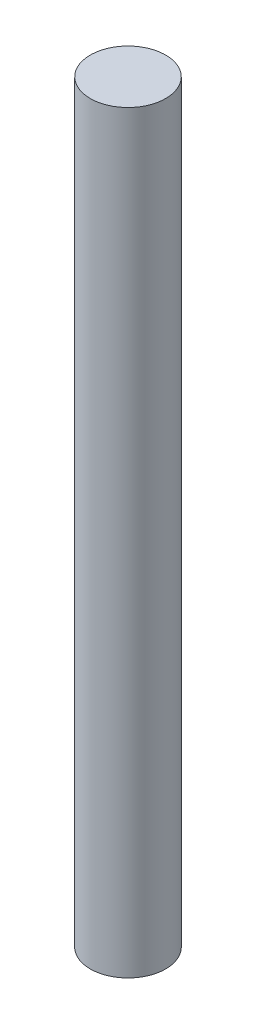
ISO-10303-21;
HEADER;
FILE_DESCRIPTION(('STEP AP214'),'2;1');
FILE_NAME('part.step','',(''),(''),'','','');
FILE_SCHEMA(('AUTOMOTIVE_DESIGN { 1 0 10303 214 1 1 1 1 }'));
ENDSEC;
DATA;
#1=APPLICATION_CONTEXT('core data for automotive mechanical design processes');
#2=APPLICATION_PROTOCOL_DEFINITION('international standard','automotive_design',2000,#1);
#3=PRODUCT_CONTEXT('',#1,'mechanical');
#4=PRODUCT('Part','Part','',(#3));
#5=PRODUCT_RELATED_PRODUCT_CATEGORY('part','',(#4));
#6=PRODUCT_DEFINITION_FORMATION('','',#4);
#7=PRODUCT_DEFINITION_CONTEXT('part definition',#1,'design');
#8=PRODUCT_DEFINITION('design','',#6,#7);
#9=PRODUCT_DEFINITION_SHAPE('','',#8);
#10=(LENGTH_UNIT() NAMED_UNIT(*) SI_UNIT(.MILLI.,.METRE.));
#11=(NAMED_UNIT(*) PLANE_ANGLE_UNIT() SI_UNIT($,.RADIAN.));
#12=(NAMED_UNIT(*) SI_UNIT($,.STERADIAN.) SOLID_ANGLE_UNIT());
#13=UNCERTAINTY_MEASURE_WITH_UNIT(LENGTH_MEASURE(1.E-05),#10,'distance_accuracy_value','');
#14=(GEOMETRIC_REPRESENTATION_CONTEXT(3) GLOBAL_UNCERTAINTY_ASSIGNED_CONTEXT((#13)) GLOBAL_UNIT_ASSIGNED_CONTEXT((#10,
#11,#12)) REPRESENTATION_CONTEXT('',''));
#15=CARTESIAN_POINT('',(0.,0.,0.));
#16=DIRECTION('',(0.,0.,1.));
#17=DIRECTION('',(1.,0.,0.));
#18=AXIS2_PLACEMENT_3D('',#15,#16,#17);
#19=CARTESIAN_POINT('',(0.,254.,0.));
#20=DIRECTION('',(0.,-1.,0.));
#21=DIRECTION('',(0.,0.,-1.));
#22=AXIS2_PLACEMENT_3D('',#19,#20,#21);
#23=CYLINDRICAL_SURFACE('',#22,12.7);
#24=CARTESIAN_POINT('',(0.,254.,0.));
#25=DIRECTION('',(0.,1.,0.));
#26=DIRECTION('',(0.,0.,1.));
#27=AXIS2_PLACEMENT_3D('',#24,#25,#26);
#28=CIRCLE('',#27,12.7);
#29=CARTESIAN_POINT('',(0.,254.,12.7));
#30=VERTEX_POINT('',#29);
#31=EDGE_CURVE('E10',#30,#30,#28,.T.);
#32=ORIENTED_EDGE('',*,*,#31,.F.);
#33=EDGE_LOOP('',(#32));
#34=FACE_BOUND('',#33,.T.);
#35=CARTESIAN_POINT('',(0.,0.,0.));
#36=DIRECTION('',(0.,1.,0.));
#37=DIRECTION('',(0.,0.,1.));
#38=AXIS2_PLACEMENT_3D('',#35,#36,#37);
#39=CIRCLE('',#38,12.7);
#40=CARTESIAN_POINT('',(0.,0.,12.7));
#41=VERTEX_POINT('',#40);
#42=EDGE_CURVE('E46',#41,#41,#39,.T.);
#43=ORIENTED_EDGE('',*,*,#42,.T.);
#44=EDGE_LOOP('',(#43));
#45=FACE_BOUND('',#44,.T.);
#46=ADVANCED_FACE('F43',(#34,#45),#23,.T.);
#47=CARTESIAN_POINT('',(0.,254.,0.));
#48=DIRECTION('',(0.,1.,0.));
#49=DIRECTION('',(0.,0.,1.));
#50=AXIS2_PLACEMENT_3D('',#47,#48,#49);
#51=PLANE('',#50);
#52=ORIENTED_EDGE('',*,*,#31,.T.);
#53=EDGE_LOOP('',(#52));
#54=FACE_BOUND('',#53,.T.);
#55=ADVANCED_FACE('F60',(#54),#51,.T.);
#56=CARTESIAN_POINT('',(0.,0.,0.));
#57=DIRECTION('',(0.,1.,0.));
#58=DIRECTION('',(0.,0.,1.));
#59=AXIS2_PLACEMENT_3D('',#56,#57,#58);
#60=PLANE('',#59);
#61=ORIENTED_EDGE('',*,*,#42,.F.);
#62=EDGE_LOOP('',(#61));
#63=FACE_BOUND('',#62,.T.);
#64=ADVANCED_FACE('F58',(#63),#60,.F.);
#65=CLOSED_SHELL('',(#46,#55,#64));
#66=MANIFOLD_SOLID_BREP('B2',#65);
#67=ADVANCED_BREP_SHAPE_REPRESENTATION('',(#18,#66),#14);
#68=SHAPE_DEFINITION_REPRESENTATION(#9,#67);
ENDSEC;
END-ISO-10303-21;
